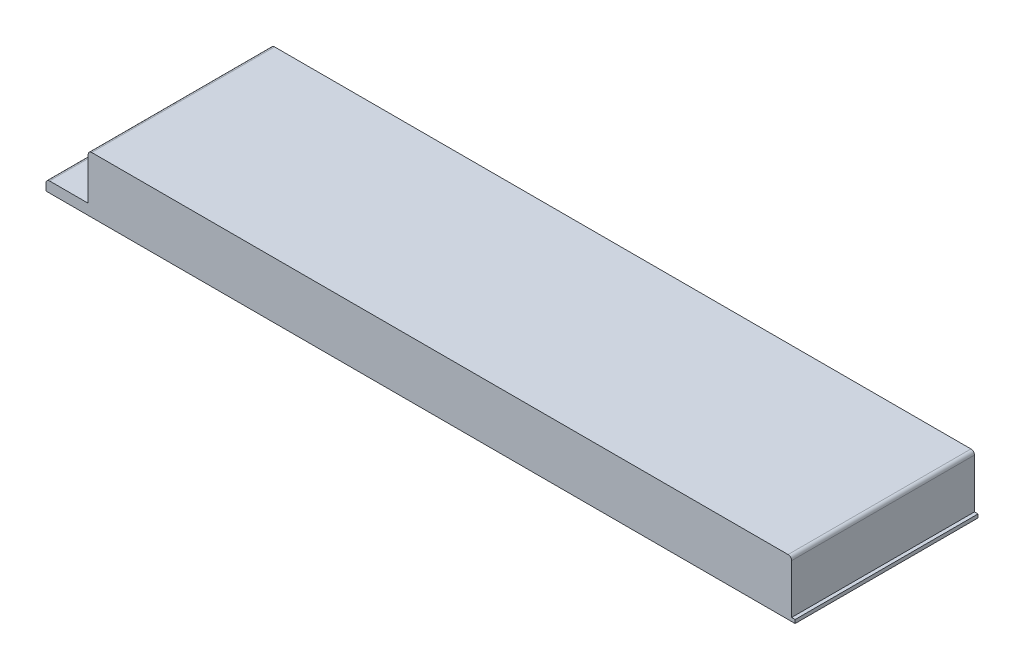
ISO-10303-21;
HEADER;
FILE_DESCRIPTION(('STEP AP214'),'2;1');
FILE_NAME('part.step','',(''),(''),'','','');
FILE_SCHEMA(('AUTOMOTIVE_DESIGN { 1 0 10303 214 1 1 1 1 }'));
ENDSEC;
DATA;
#1=APPLICATION_CONTEXT('core data for automotive mechanical design processes');
#2=APPLICATION_PROTOCOL_DEFINITION('international standard','automotive_design',2000,#1);
#3=PRODUCT_CONTEXT('',#1,'mechanical');
#4=PRODUCT('Part','Part','',(#3));
#5=PRODUCT_RELATED_PRODUCT_CATEGORY('part','',(#4));
#6=PRODUCT_DEFINITION_FORMATION('','',#4);
#7=PRODUCT_DEFINITION_CONTEXT('part definition',#1,'design');
#8=PRODUCT_DEFINITION('design','',#6,#7);
#9=PRODUCT_DEFINITION_SHAPE('','',#8);
#10=(LENGTH_UNIT() NAMED_UNIT(*) SI_UNIT(.MILLI.,.METRE.));
#11=(NAMED_UNIT(*) PLANE_ANGLE_UNIT() SI_UNIT($,.RADIAN.));
#12=(NAMED_UNIT(*) SI_UNIT($,.STERADIAN.) SOLID_ANGLE_UNIT());
#13=UNCERTAINTY_MEASURE_WITH_UNIT(LENGTH_MEASURE(1.E-05),#10,'distance_accuracy_value','');
#14=(GEOMETRIC_REPRESENTATION_CONTEXT(3) GLOBAL_UNCERTAINTY_ASSIGNED_CONTEXT((#13)) GLOBAL_UNIT_ASSIGNED_CONTEXT((#10,
#11,#12)) REPRESENTATION_CONTEXT('',''));
#15=CARTESIAN_POINT('',(0.,0.,0.));
#16=DIRECTION('',(0.,0.,1.));
#17=DIRECTION('',(1.,0.,0.));
#18=AXIS2_PLACEMENT_3D('',#15,#16,#17);
#19=CARTESIAN_POINT('',(9.5,-99.9249718538865,23.));
#20=DIRECTION('',(0.,0.,1.));
#21=DIRECTION('',(1.,0.,0.));
#22=AXIS2_PLACEMENT_3D('',#19,#20,#21);
#23=PLANE('',#22);
#24=DIRECTION('',(0.,1.,0.));
#25=VECTOR('',#24,1.);
#26=CARTESIAN_POINT('',(102.5,-99.9249718538865,23.));
#27=LINE('',#26,#25);
#28=CARTESIAN_POINT('',(102.5,0.,23.));
#29=VERTEX_POINT('',#28);
#30=CARTESIAN_POINT('',(102.5,5.,23.));
#31=VERTEX_POINT('',#30);
#32=EDGE_CURVE('E144',#29,#31,#27,.T.);
#33=ORIENTED_EDGE('',*,*,#32,.F.);
#34=DIRECTION('',(1.,0.,0.));
#35=VECTOR('',#34,1.);
#36=CARTESIAN_POINT('',(9.5,0.,23.));
#37=LINE('',#36,#35);
#38=CARTESIAN_POINT('',(9.5,0.,23.));
#39=VERTEX_POINT('',#38);
#40=EDGE_CURVE('E148',#39,#29,#37,.T.);
#41=ORIENTED_EDGE('',*,*,#40,.F.);
#42=DIRECTION('',(0.,1.,0.));
#43=VECTOR('',#42,1.);
#44=CARTESIAN_POINT('',(9.5,-99.9249718538865,23.));
#45=LINE('',#44,#43);
#46=CARTESIAN_POINT('',(9.5,5.,23.));
#47=VERTEX_POINT('',#46);
#48=EDGE_CURVE('E178',#39,#47,#45,.T.);
#49=ORIENTED_EDGE('',*,*,#48,.T.);
#50=DIRECTION('',(1.,0.,0.));
#51=VECTOR('',#50,1.);
#52=CARTESIAN_POINT('',(9.5,5.,23.));
#53=LINE('',#52,#51);
#54=EDGE_CURVE('E151',#47,#31,#53,.T.);
#55=ORIENTED_EDGE('',*,*,#54,.T.);
#56=EDGE_LOOP('',(#33,#41,#49,#55));
#57=FACE_BOUND('',#56,.T.);
#58=ADVANCED_FACE('F38',(#57),#23,.F.);
#59=CARTESIAN_POINT('',(102.5,-99.9249718538865,3.));
#60=DIRECTION('',(0.,0.,-1.));
#61=DIRECTION('',(-1.,0.,0.));
#62=AXIS2_PLACEMENT_3D('',#59,#60,#61);
#63=PLANE('',#62);
#64=DIRECTION('',(-1.,0.,0.));
#65=VECTOR('',#64,1.);
#66=CARTESIAN_POINT('',(102.5,5.,3.));
#67=LINE('',#66,#65);
#68=CARTESIAN_POINT('',(102.5,5.,3.));
#69=VERTEX_POINT('',#68);
#70=CARTESIAN_POINT('',(9.5,5.,3.));
#71=VERTEX_POINT('',#70);
#72=EDGE_CURVE('E590',#69,#71,#67,.T.);
#73=ORIENTED_EDGE('',*,*,#72,.T.);
#74=DIRECTION('',(0.,1.,0.));
#75=VECTOR('',#74,1.);
#76=CARTESIAN_POINT('',(9.5,-99.9249718538865,3.));
#77=LINE('',#76,#75);
#78=CARTESIAN_POINT('',(9.5,0.,3.));
#79=VERTEX_POINT('',#78);
#80=EDGE_CURVE('E180',#79,#71,#77,.T.);
#81=ORIENTED_EDGE('',*,*,#80,.F.);
#82=DIRECTION('',(-1.,0.,0.));
#83=VECTOR('',#82,1.);
#84=CARTESIAN_POINT('',(102.5,0.,3.));
#85=LINE('',#84,#83);
#86=CARTESIAN_POINT('',(102.5,0.,3.));
#87=VERTEX_POINT('',#86);
#88=EDGE_CURVE('E164',#87,#79,#85,.T.);
#89=ORIENTED_EDGE('',*,*,#88,.F.);
#90=DIRECTION('',(0.,1.,0.));
#91=VECTOR('',#90,1.);
#92=CARTESIAN_POINT('',(102.5,-99.9249718538865,3.));
#93=LINE('',#92,#91);
#94=EDGE_CURVE('E156',#87,#69,#93,.T.);
#95=ORIENTED_EDGE('',*,*,#94,.T.);
#96=EDGE_LOOP('',(#73,#81,#89,#95));
#97=FACE_BOUND('',#96,.T.);
#98=ADVANCED_FACE('F281',(#97),#63,.F.);
#99=CARTESIAN_POINT('',(102.5,-99.9249718538865,23.));
#100=DIRECTION('',(1.,0.,0.));
#101=DIRECTION('',(0.,0.,-1.));
#102=AXIS2_PLACEMENT_3D('',#99,#100,#101);
#103=PLANE('',#102);
#104=ORIENTED_EDGE('',*,*,#94,.F.);
#105=DIRECTION('',(0.,0.,-1.));
#106=VECTOR('',#105,1.);
#107=CARTESIAN_POINT('',(102.5,0.,23.));
#108=LINE('',#107,#106);
#109=EDGE_CURVE('E159',#29,#87,#108,.T.);
#110=ORIENTED_EDGE('',*,*,#109,.F.);
#111=ORIENTED_EDGE('',*,*,#32,.T.);
#112=DIRECTION('',(0.,0.,-1.));
#113=VECTOR('',#112,1.);
#114=CARTESIAN_POINT('',(102.5,5.,23.));
#115=LINE('',#114,#113);
#116=EDGE_CURVE('E591',#31,#69,#115,.T.);
#117=ORIENTED_EDGE('',*,*,#116,.T.);
#118=EDGE_LOOP('',(#104,#110,#111,#117));
#119=FACE_BOUND('',#118,.T.);
#120=ADVANCED_FACE('F160',(#119),#103,.F.);
#121=CARTESIAN_POINT('',(9.5,-99.9249718538865,3.));
#122=DIRECTION('',(-1.,0.,0.));
#123=DIRECTION('',(0.,0.,1.));
#124=AXIS2_PLACEMENT_3D('',#121,#122,#123);
#125=PLANE('',#124);
#126=DIRECTION('',(0.,0.,1.));
#127=VECTOR('',#126,1.);
#128=CARTESIAN_POINT('',(9.5,5.,3.));
#129=LINE('',#128,#127);
#130=EDGE_CURVE('E173',#71,#47,#129,.T.);
#131=ORIENTED_EDGE('',*,*,#130,.T.);
#132=ORIENTED_EDGE('',*,*,#48,.F.);
#133=DIRECTION('',(0.,0.,1.));
#134=VECTOR('',#133,1.);
#135=CARTESIAN_POINT('',(9.5,0.,3.));
#136=LINE('',#135,#134);
#137=EDGE_CURVE('E155',#79,#39,#136,.T.);
#138=ORIENTED_EDGE('',*,*,#137,.F.);
#139=ORIENTED_EDGE('',*,*,#80,.T.);
#140=EDGE_LOOP('',(#131,#132,#138,#139));
#141=FACE_BOUND('',#140,.T.);
#142=ADVANCED_FACE('F290',(#141),#125,.F.);
#143=CARTESIAN_POINT('',(0.,8.,0.));
#144=DIRECTION('',(0.,-1.,0.));
#145=DIRECTION('',(0.,0.,-1.));
#146=AXIS2_PLACEMENT_3D('',#143,#144,#145);
#147=PLANE('',#146);
#148=DIRECTION('',(1.,0.,0.));
#149=VECTOR('',#148,1.);
#150=CARTESIAN_POINT('',(0.,8.,0.));
#151=LINE('',#150,#149);
#152=CARTESIAN_POINT('',(6.5,8.,0.));
#153=VERTEX_POINT('',#152);
#154=CARTESIAN_POINT('',(105.5,8.,0.));
#155=VERTEX_POINT('',#154);
#156=EDGE_CURVE('E217',#153,#155,#151,.T.);
#157=ORIENTED_EDGE('',*,*,#156,.F.);
#158=DIRECTION('',(0.,0.,1.));
#159=VECTOR('',#158,1.);
#160=CARTESIAN_POINT('',(6.5,8.,0.));
#161=LINE('',#160,#159);
#162=CARTESIAN_POINT('',(6.5,8.,26.));
#163=VERTEX_POINT('',#162);
#164=EDGE_CURVE('E236',#153,#163,#161,.T.);
#165=ORIENTED_EDGE('',*,*,#164,.T.);
#166=DIRECTION('',(1.,0.,0.));
#167=VECTOR('',#166,1.);
#168=CARTESIAN_POINT('',(0.,8.,26.));
#169=LINE('',#168,#167);
#170=CARTESIAN_POINT('',(105.5,8.,26.));
#171=VERTEX_POINT('',#170);
#172=EDGE_CURVE('E219',#163,#171,#169,.T.);
#173=ORIENTED_EDGE('',*,*,#172,.T.);
#174=DIRECTION('',(0.,0.,1.));
#175=VECTOR('',#174,1.);
#176=CARTESIAN_POINT('',(105.5,8.,0.));
#177=LINE('',#176,#175);
#178=EDGE_CURVE('E233',#171,#155,#177,.F.);
#179=ORIENTED_EDGE('',*,*,#178,.T.);
#180=EDGE_LOOP('',(#157,#165,#173,#179));
#181=FACE_BOUND('',#180,.T.);
#182=ADVANCED_FACE('F309',(#181),#147,.F.);
#183=CARTESIAN_POINT('',(0.,8.,0.));
#184=DIRECTION('',(0.,0.,-1.));
#185=DIRECTION('',(-1.,0.,0.));
#186=AXIS2_PLACEMENT_3D('',#183,#184,#185);
#187=PLANE('',#186);
#188=DIRECTION('',(0.,-1.,0.));
#189=VECTOR('',#188,1.);
#190=CARTESIAN_POINT('',(106.5,0.,0.));
#191=LINE('',#190,#189);
#192=CARTESIAN_POINT('',(106.5,0.5,0.));
#193=VERTEX_POINT('',#192);
#194=CARTESIAN_POINT('',(106.5,0.,0.));
#195=VERTEX_POINT('',#194);
#196=EDGE_CURVE('E53',#193,#195,#191,.T.);
#197=ORIENTED_EDGE('',*,*,#196,.T.);
#198=DIRECTION('',(1.,0.,0.));
#199=VECTOR('',#198,1.);
#200=CARTESIAN_POINT('',(0.,0.,0.));
#201=LINE('',#200,#199);
#202=CARTESIAN_POINT('',(0.,0.,0.));
#203=VERTEX_POINT('',#202);
#204=EDGE_CURVE('E204',#203,#195,#201,.T.);
#205=ORIENTED_EDGE('',*,*,#204,.F.);
#206=DIRECTION('',(0.,-1.,0.));
#207=VECTOR('',#206,1.);
#208=CARTESIAN_POINT('',(0.,8.,0.));
#209=LINE('',#208,#207);
#210=CARTESIAN_POINT('',(0.,1.,0.));
#211=VERTEX_POINT('',#210);
#212=EDGE_CURVE('E231',#211,#203,#209,.T.);
#213=ORIENTED_EDGE('',*,*,#212,.F.);
#214=CARTESIAN_POINT('',(0.5,1.,0.));
#215=DIRECTION('',(0.,0.,-1.));
#216=DIRECTION('',(-1.,0.,0.));
#217=AXIS2_PLACEMENT_3D('',#214,#215,#216);
#218=CIRCLE('',#217,0.5);
#219=CARTESIAN_POINT('',(0.5,1.5,0.));
#220=VERTEX_POINT('',#219);
#221=EDGE_CURVE('E248',#211,#220,#218,.T.);
#222=ORIENTED_EDGE('',*,*,#221,.T.);
#223=DIRECTION('',(1.,0.,0.));
#224=VECTOR('',#223,1.);
#225=CARTESIAN_POINT('',(0.,1.5,0.));
#226=LINE('',#225,#224);
#227=CARTESIAN_POINT('',(6.,1.5,0.));
#228=VERTEX_POINT('',#227);
#229=EDGE_CURVE('E212',#220,#228,#226,.T.);
#230=ORIENTED_EDGE('',*,*,#229,.T.);
#231=DIRECTION('',(0.,1.,0.));
#232=VECTOR('',#231,1.);
#233=CARTESIAN_POINT('',(6.,8.,0.));
#234=LINE('',#233,#232);
#235=CARTESIAN_POINT('',(6.,7.5,0.));
#236=VERTEX_POINT('',#235);
#237=EDGE_CURVE('E208',#228,#236,#234,.T.);
#238=ORIENTED_EDGE('',*,*,#237,.T.);
#239=CARTESIAN_POINT('',(6.5,7.5,0.));
#240=DIRECTION('',(0.,0.,-1.));
#241=DIRECTION('',(-1.,0.,0.));
#242=AXIS2_PLACEMENT_3D('',#239,#240,#241);
#243=CIRCLE('',#242,0.5);
#244=EDGE_CURVE('E250',#236,#153,#243,.T.);
#245=ORIENTED_EDGE('',*,*,#244,.T.);
#246=ORIENTED_EDGE('',*,*,#156,.T.);
#247=CARTESIAN_POINT('',(105.5,7.5,0.));
#248=DIRECTION('',(0.,0.,-1.));
#249=DIRECTION('',(-1.,0.,0.));
#250=AXIS2_PLACEMENT_3D('',#247,#248,#249);
#251=CIRCLE('',#250,0.5);
#252=CARTESIAN_POINT('',(106.,7.5,0.));
#253=VERTEX_POINT('',#252);
#254=EDGE_CURVE('E60',#155,#253,#251,.T.);
#255=ORIENTED_EDGE('',*,*,#254,.T.);
#256=DIRECTION('',(0.,-1.,0.));
#257=VECTOR('',#256,1.);
#258=CARTESIAN_POINT('',(106.,8.,0.));
#259=LINE('',#258,#257);
#260=CARTESIAN_POINT('',(106.,0.5,0.));
#261=VERTEX_POINT('',#260);
#262=EDGE_CURVE('E190',#253,#261,#259,.T.);
#263=ORIENTED_EDGE('',*,*,#262,.T.);
#264=DIRECTION('',(1.,0.,0.));
#265=VECTOR('',#264,1.);
#266=CARTESIAN_POINT('',(107.,0.5,0.));
#267=LINE('',#266,#265);
#268=EDGE_CURVE('E192',#261,#193,#267,.T.);
#269=ORIENTED_EDGE('',*,*,#268,.T.);
#270=EDGE_LOOP('',(#197,#205,#213,#222,#230,#238,#245,#246,#255,#263,#269));
#271=FACE_BOUND('',#270,.T.);
#272=ADVANCED_FACE('F311',(#271),#187,.T.);
#273=CARTESIAN_POINT('',(0.,8.,0.));
#274=DIRECTION('',(1.,0.,0.));
#275=DIRECTION('',(0.,0.,-1.));
#276=AXIS2_PLACEMENT_3D('',#273,#274,#275);
#277=PLANE('',#276);
#278=DIRECTION('',(0.,-1.,0.));
#279=VECTOR('',#278,1.);
#280=CARTESIAN_POINT('',(0.,8.,26.));
#281=LINE('',#280,#279);
#282=CARTESIAN_POINT('',(0.,1.,26.));
#283=VERTEX_POINT('',#282);
#284=CARTESIAN_POINT('',(0.,0.,26.));
#285=VERTEX_POINT('',#284);
#286=EDGE_CURVE('E223',#283,#285,#281,.T.);
#287=ORIENTED_EDGE('',*,*,#286,.F.);
#288=DIRECTION('',(0.,0.,1.));
#289=VECTOR('',#288,1.);
#290=CARTESIAN_POINT('',(0.,1.,0.));
#291=LINE('',#290,#289);
#292=EDGE_CURVE('E255',#283,#211,#291,.F.);
#293=ORIENTED_EDGE('',*,*,#292,.T.);
#294=ORIENTED_EDGE('',*,*,#212,.T.);
#295=DIRECTION('',(0.,0.,1.));
#296=VECTOR('',#295,1.);
#297=CARTESIAN_POINT('',(0.,0.,0.));
#298=LINE('',#297,#296);
#299=EDGE_CURVE('E220',#203,#285,#298,.T.);
#300=ORIENTED_EDGE('',*,*,#299,.T.);
#301=EDGE_LOOP('',(#287,#293,#294,#300));
#302=FACE_BOUND('',#301,.T.);
#303=ADVANCED_FACE('F275',(#302),#277,.F.);
#304=CARTESIAN_POINT('',(0.,8.,26.));
#305=DIRECTION('',(0.,0.,-1.));
#306=DIRECTION('',(-1.,0.,0.));
#307=AXIS2_PLACEMENT_3D('',#304,#305,#306);
#308=PLANE('',#307);
#309=DIRECTION('',(1.,0.,0.));
#310=VECTOR('',#309,1.);
#311=CARTESIAN_POINT('',(0.,0.,26.));
#312=LINE('',#311,#310);
#313=CARTESIAN_POINT('',(106.5,0.,26.));
#314=VERTEX_POINT('',#313);
#315=EDGE_CURVE('E226',#285,#314,#312,.T.);
#316=ORIENTED_EDGE('',*,*,#315,.T.);
#317=DIRECTION('',(0.,-1.,0.));
#318=VECTOR('',#317,1.);
#319=CARTESIAN_POINT('',(106.5,0.,26.));
#320=LINE('',#319,#318);
#321=CARTESIAN_POINT('',(106.5,0.5,26.));
#322=VERTEX_POINT('',#321);
#323=EDGE_CURVE('E347',#322,#314,#320,.T.);
#324=ORIENTED_EDGE('',*,*,#323,.F.);
#325=DIRECTION('',(1.,0.,0.));
#326=VECTOR('',#325,1.);
#327=CARTESIAN_POINT('',(107.,0.5,26.));
#328=LINE('',#327,#326);
#329=CARTESIAN_POINT('',(106.,0.5,26.));
#330=VERTEX_POINT('',#329);
#331=EDGE_CURVE('E193',#330,#322,#328,.T.);
#332=ORIENTED_EDGE('',*,*,#331,.F.);
#333=DIRECTION('',(0.,-1.,0.));
#334=VECTOR('',#333,1.);
#335=CARTESIAN_POINT('',(106.,8.,26.));
#336=LINE('',#335,#334);
#337=CARTESIAN_POINT('',(106.,7.5,26.));
#338=VERTEX_POINT('',#337);
#339=EDGE_CURVE('E197',#338,#330,#336,.T.);
#340=ORIENTED_EDGE('',*,*,#339,.F.);
#341=CARTESIAN_POINT('',(105.5,7.5,26.));
#342=DIRECTION('',(0.,0.,-1.));
#343=DIRECTION('',(-1.,0.,0.));
#344=AXIS2_PLACEMENT_3D('',#341,#342,#343);
#345=CIRCLE('',#344,0.5);
#346=EDGE_CURVE('E239',#338,#171,#345,.F.);
#347=ORIENTED_EDGE('',*,*,#346,.T.);
#348=ORIENTED_EDGE('',*,*,#172,.F.);
#349=CARTESIAN_POINT('',(6.5,7.5,26.));
#350=DIRECTION('',(0.,0.,-1.));
#351=DIRECTION('',(-1.,0.,0.));
#352=AXIS2_PLACEMENT_3D('',#349,#350,#351);
#353=CIRCLE('',#352,0.5);
#354=CARTESIAN_POINT('',(6.,7.5,26.));
#355=VERTEX_POINT('',#354);
#356=EDGE_CURVE('E243',#163,#355,#353,.F.);
#357=ORIENTED_EDGE('',*,*,#356,.T.);
#358=DIRECTION('',(0.,1.,0.));
#359=VECTOR('',#358,1.);
#360=CARTESIAN_POINT('',(6.,8.,26.));
#361=LINE('',#360,#359);
#362=CARTESIAN_POINT('',(6.,1.5,26.));
#363=VERTEX_POINT('',#362);
#364=EDGE_CURVE('E209',#363,#355,#361,.T.);
#365=ORIENTED_EDGE('',*,*,#364,.F.);
#366=DIRECTION('',(1.,0.,0.));
#367=VECTOR('',#366,1.);
#368=CARTESIAN_POINT('',(0.,1.5,26.));
#369=LINE('',#368,#367);
#370=CARTESIAN_POINT('',(0.500000000000014,1.5,26.));
#371=VERTEX_POINT('',#370);
#372=EDGE_CURVE('E199',#371,#363,#369,.T.);
#373=ORIENTED_EDGE('',*,*,#372,.F.);
#374=CARTESIAN_POINT('',(0.500000000000014,1.,26.));
#375=DIRECTION('',(0.,0.,-1.));
#376=DIRECTION('',(-1.,0.,0.));
#377=AXIS2_PLACEMENT_3D('',#374,#375,#376);
#378=CIRCLE('',#377,0.5);
#379=EDGE_CURVE('E241',#371,#283,#378,.F.);
#380=ORIENTED_EDGE('',*,*,#379,.T.);
#381=ORIENTED_EDGE('',*,*,#286,.T.);
#382=EDGE_LOOP('',(#316,#324,#332,#340,#347,#348,#357,#365,#373,#380,#381));
#383=FACE_BOUND('',#382,.T.);
#384=ADVANCED_FACE('F266',(#383),#308,.F.);
#385=CARTESIAN_POINT('',(0.,0.,0.));
#386=DIRECTION('',(0.,-1.,0.));
#387=DIRECTION('',(0.,0.,-1.));
#388=AXIS2_PLACEMENT_3D('',#385,#386,#387);
#389=PLANE('',#388);
#390=ORIENTED_EDGE('',*,*,#109,.T.);
#391=ORIENTED_EDGE('',*,*,#88,.T.);
#392=ORIENTED_EDGE('',*,*,#137,.T.);
#393=ORIENTED_EDGE('',*,*,#40,.T.);
#394=EDGE_LOOP('',(#390,#391,#392,#393));
#395=FACE_BOUND('',#394,.T.);
#396=DIRECTION('',(0.,0.,1.));
#397=VECTOR('',#396,1.);
#398=CARTESIAN_POINT('',(106.5,0.,0.));
#399=LINE('',#398,#397);
#400=EDGE_CURVE('E344',#195,#314,#399,.T.);
#401=ORIENTED_EDGE('',*,*,#400,.T.);
#402=ORIENTED_EDGE('',*,*,#315,.F.);
#403=ORIENTED_EDGE('',*,*,#299,.F.);
#404=ORIENTED_EDGE('',*,*,#204,.T.);
#405=EDGE_LOOP('',(#401,#402,#403,#404));
#406=FACE_BOUND('',#405,.T.);
#407=CARTESIAN_POINT('',(3.,0.,13.));
#408=DIRECTION('',(0.,-1.,0.));
#409=DIRECTION('',(0.,0.,-1.));
#410=AXIS2_PLACEMENT_3D('',#407,#408,#409);
#411=CIRCLE('',#410,1.2);
#412=CARTESIAN_POINT('',(3.,0.,11.8));
#413=VERTEX_POINT('',#412);
#414=EDGE_CURVE('E189',#413,#413,#411,.T.);
#415=ORIENTED_EDGE('',*,*,#414,.F.);
#416=EDGE_LOOP('',(#415));
#417=FACE_BOUND('',#416,.T.);
#418=ADVANCED_FACE('F167',(#395,#406,#417),#389,.T.);
#419=CARTESIAN_POINT('',(6.,8.,0.));
#420=DIRECTION('',(1.,0.,0.));
#421=DIRECTION('',(0.,0.,-1.));
#422=AXIS2_PLACEMENT_3D('',#419,#420,#421);
#423=PLANE('',#422);
#424=ORIENTED_EDGE('',*,*,#364,.T.);
#425=DIRECTION('',(0.,0.,1.));
#426=VECTOR('',#425,1.);
#427=CARTESIAN_POINT('',(6.,7.5,0.));
#428=LINE('',#427,#426);
#429=EDGE_CURVE('E245',#355,#236,#428,.F.);
#430=ORIENTED_EDGE('',*,*,#429,.T.);
#431=ORIENTED_EDGE('',*,*,#237,.F.);
#432=DIRECTION('',(0.,0.,1.));
#433=VECTOR('',#432,1.);
#434=CARTESIAN_POINT('',(6.,1.5,0.));
#435=LINE('',#434,#433);
#436=EDGE_CURVE('E205',#228,#363,#435,.T.);
#437=ORIENTED_EDGE('',*,*,#436,.T.);
#438=EDGE_LOOP('',(#424,#430,#431,#437));
#439=FACE_BOUND('',#438,.T.);
#440=ADVANCED_FACE('F265',(#439),#423,.F.);
#441=CARTESIAN_POINT('',(0.,1.5,0.));
#442=DIRECTION('',(0.,-1.,0.));
#443=DIRECTION('',(1.,0.,0.));
#444=AXIS2_PLACEMENT_3D('',#441,#442,#443);
#445=PLANE('',#444);
#446=CARTESIAN_POINT('',(3.,1.5,13.));
#447=DIRECTION('',(0.,1.,0.));
#448=DIRECTION('',(0.,0.,1.));
#449=AXIS2_PLACEMENT_3D('',#446,#447,#448);
#450=CIRCLE('',#449,2.2);
#451=CARTESIAN_POINT('',(3.,1.5,15.2));
#452=VERTEX_POINT('',#451);
#453=EDGE_CURVE('E176',#452,#452,#450,.T.);
#454=ORIENTED_EDGE('',*,*,#453,.F.);
#455=EDGE_LOOP('',(#454));
#456=FACE_BOUND('',#455,.T.);
#457=ORIENTED_EDGE('',*,*,#229,.F.);
#458=DIRECTION('',(0.,0.,1.));
#459=VECTOR('',#458,1.);
#460=CARTESIAN_POINT('',(0.5,1.5,0.));
#461=LINE('',#460,#459);
#462=EDGE_CURVE('E252',#220,#371,#461,.T.);
#463=ORIENTED_EDGE('',*,*,#462,.T.);
#464=ORIENTED_EDGE('',*,*,#372,.T.);
#465=ORIENTED_EDGE('',*,*,#436,.F.);
#466=EDGE_LOOP('',(#457,#463,#464,#465));
#467=FACE_BOUND('',#466,.T.);
#468=ADVANCED_FACE('F272',(#456,#467),#445,.F.);
#469=CARTESIAN_POINT('',(107.,0.5,0.));
#470=DIRECTION('',(0.,-1.,0.));
#471=DIRECTION('',(1.,0.,0.));
#472=AXIS2_PLACEMENT_3D('',#469,#470,#471);
#473=PLANE('',#472);
#474=ORIENTED_EDGE('',*,*,#331,.T.);
#475=DIRECTION('',(0.,0.,-1.));
#476=VECTOR('',#475,1.);
#477=CARTESIAN_POINT('',(106.5,0.5,0.));
#478=LINE('',#477,#476);
#479=EDGE_CURVE('E11',#322,#193,#478,.T.);
#480=ORIENTED_EDGE('',*,*,#479,.T.);
#481=ORIENTED_EDGE('',*,*,#268,.F.);
#482=DIRECTION('',(0.,0.,1.));
#483=VECTOR('',#482,1.);
#484=CARTESIAN_POINT('',(106.,0.5,0.));
#485=LINE('',#484,#483);
#486=EDGE_CURVE('E196',#261,#330,#485,.T.);
#487=ORIENTED_EDGE('',*,*,#486,.T.);
#488=EDGE_LOOP('',(#474,#480,#481,#487));
#489=FACE_BOUND('',#488,.T.);
#490=ADVANCED_FACE('F298',(#489),#473,.F.);
#491=CARTESIAN_POINT('',(106.,8.,0.));
#492=DIRECTION('',(-1.,0.,0.));
#493=DIRECTION('',(0.,0.,1.));
#494=AXIS2_PLACEMENT_3D('',#491,#492,#493);
#495=PLANE('',#494);
#496=ORIENTED_EDGE('',*,*,#262,.F.);
#497=DIRECTION('',(0.,0.,1.));
#498=VECTOR('',#497,1.);
#499=CARTESIAN_POINT('',(106.,7.5,0.));
#500=LINE('',#499,#498);
#501=EDGE_CURVE('E46',#253,#338,#500,.T.);
#502=ORIENTED_EDGE('',*,*,#501,.T.);
#503=ORIENTED_EDGE('',*,*,#339,.T.);
#504=ORIENTED_EDGE('',*,*,#486,.F.);
#505=EDGE_LOOP('',(#496,#502,#503,#504));
#506=FACE_BOUND('',#505,.T.);
#507=ADVANCED_FACE('F301',(#506),#495,.F.);
#508=CARTESIAN_POINT('',(6.5,7.5,0.));
#509=DIRECTION('',(0.,0.,1.));
#510=DIRECTION('',(1.,0.,0.));
#511=AXIS2_PLACEMENT_3D('',#508,#509,#510);
#512=CYLINDRICAL_SURFACE('',#511,0.5);
#513=ORIENTED_EDGE('',*,*,#244,.F.);
#514=ORIENTED_EDGE('',*,*,#429,.F.);
#515=ORIENTED_EDGE('',*,*,#356,.F.);
#516=ORIENTED_EDGE('',*,*,#164,.F.);
#517=EDGE_LOOP('',(#513,#514,#515,#516));
#518=FACE_BOUND('',#517,.T.);
#519=ADVANCED_FACE('F305',(#518),#512,.T.);
#520=CARTESIAN_POINT('',(0.5,1.,0.));
#521=DIRECTION('',(0.,0.,1.));
#522=DIRECTION('',(1.,0.,0.));
#523=AXIS2_PLACEMENT_3D('',#520,#521,#522);
#524=CYLINDRICAL_SURFACE('',#523,0.5);
#525=ORIENTED_EDGE('',*,*,#221,.F.);
#526=ORIENTED_EDGE('',*,*,#292,.F.);
#527=ORIENTED_EDGE('',*,*,#379,.F.);
#528=ORIENTED_EDGE('',*,*,#462,.F.);
#529=EDGE_LOOP('',(#525,#526,#527,#528));
#530=FACE_BOUND('',#529,.T.);
#531=ADVANCED_FACE('F341',(#530),#524,.T.);
#532=CARTESIAN_POINT('',(105.5,7.5,0.));
#533=DIRECTION('',(0.,0.,1.));
#534=DIRECTION('',(1.,0.,0.));
#535=AXIS2_PLACEMENT_3D('',#532,#533,#534);
#536=CYLINDRICAL_SURFACE('',#535,0.5);
#537=ORIENTED_EDGE('',*,*,#254,.F.);
#538=ORIENTED_EDGE('',*,*,#178,.F.);
#539=ORIENTED_EDGE('',*,*,#346,.F.);
#540=ORIENTED_EDGE('',*,*,#501,.F.);
#541=EDGE_LOOP('',(#537,#538,#539,#540));
#542=FACE_BOUND('',#541,.T.);
#543=ADVANCED_FACE('F40',(#542),#536,.T.);
#544=CARTESIAN_POINT('',(3.,1.5,13.));
#545=DIRECTION('',(0.,1.,0.));
#546=DIRECTION('',(0.,0.,1.));
#547=AXIS2_PLACEMENT_3D('',#544,#545,#546);
#548=CYLINDRICAL_SURFACE('',#547,1.2);
#549=ORIENTED_EDGE('',*,*,#414,.T.);
#550=EDGE_LOOP('',(#549));
#551=FACE_BOUND('',#550,.T.);
#552=CARTESIAN_POINT('',(3.,0.499999999999999,13.));
#553=DIRECTION('',(0.,1.,0.));
#554=DIRECTION('',(0.,0.,1.));
#555=AXIS2_PLACEMENT_3D('',#552,#553,#554);
#556=CIRCLE('',#555,1.2);
#557=CARTESIAN_POINT('',(3.,0.499999999999999,14.2));
#558=VERTEX_POINT('',#557);
#559=EDGE_CURVE('E186',#558,#558,#556,.T.);
#560=ORIENTED_EDGE('',*,*,#559,.T.);
#561=EDGE_LOOP('',(#560));
#562=FACE_BOUND('',#561,.T.);
#563=ADVANCED_FACE('F261',(#551,#562),#548,.F.);
#564=CARTESIAN_POINT('',(3.,1.5,13.));
#565=DIRECTION('',(0.,1.,0.));
#566=DIRECTION('',(0.,0.,1.));
#567=AXIS2_PLACEMENT_3D('',#564,#565,#566);
#568=CONICAL_SURFACE('',#567,2.2,0.785398163397449);
#569=ORIENTED_EDGE('',*,*,#559,.F.);
#570=EDGE_LOOP('',(#569));
#571=FACE_BOUND('',#570,.T.);
#572=ORIENTED_EDGE('',*,*,#453,.T.);
#573=EDGE_LOOP('',(#572));
#574=FACE_BOUND('',#573,.T.);
#575=ADVANCED_FACE('F291',(#571,#574),#568,.F.);
#576=CARTESIAN_POINT('',(106.5,0.,0.));
#577=DIRECTION('',(-1.,0.,0.));
#578=DIRECTION('',(0.,0.,1.));
#579=AXIS2_PLACEMENT_3D('',#576,#577,#578);
#580=PLANE('',#579);
#581=ORIENTED_EDGE('',*,*,#323,.T.);
#582=ORIENTED_EDGE('',*,*,#400,.F.);
#583=ORIENTED_EDGE('',*,*,#196,.F.);
#584=ORIENTED_EDGE('',*,*,#479,.F.);
#585=EDGE_LOOP('',(#581,#582,#583,#584));
#586=FACE_BOUND('',#585,.T.);
#587=ADVANCED_FACE('F294',(#586),#580,.F.);
#588=CARTESIAN_POINT('',(0.,5.,0.));
#589=DIRECTION('',(0.,1.,0.));
#590=DIRECTION('',(0.,0.,1.));
#591=AXIS2_PLACEMENT_3D('',#588,#589,#590);
#592=PLANE('',#591);
#593=ORIENTED_EDGE('',*,*,#72,.F.);
#594=ORIENTED_EDGE('',*,*,#116,.F.);
#595=ORIENTED_EDGE('',*,*,#54,.F.);
#596=ORIENTED_EDGE('',*,*,#130,.F.);
#597=EDGE_LOOP('',(#593,#594,#595,#596));
#598=FACE_BOUND('',#597,.T.);
#599=ADVANCED_FACE('F418',(#598),#592,.F.);
#600=CLOSED_SHELL('',(#58,#98,#120,#142,#182,#272,#303,#384,#418,#440,#468,#490,#507,#519,#531,
#543,#563,#575,#587,#599));
#601=MANIFOLD_SOLID_BREP('B2',#600);
#602=ADVANCED_BREP_SHAPE_REPRESENTATION('',(#18,#601),#14);
#603=SHAPE_DEFINITION_REPRESENTATION(#9,#602);
ENDSEC;
END-ISO-10303-21;
